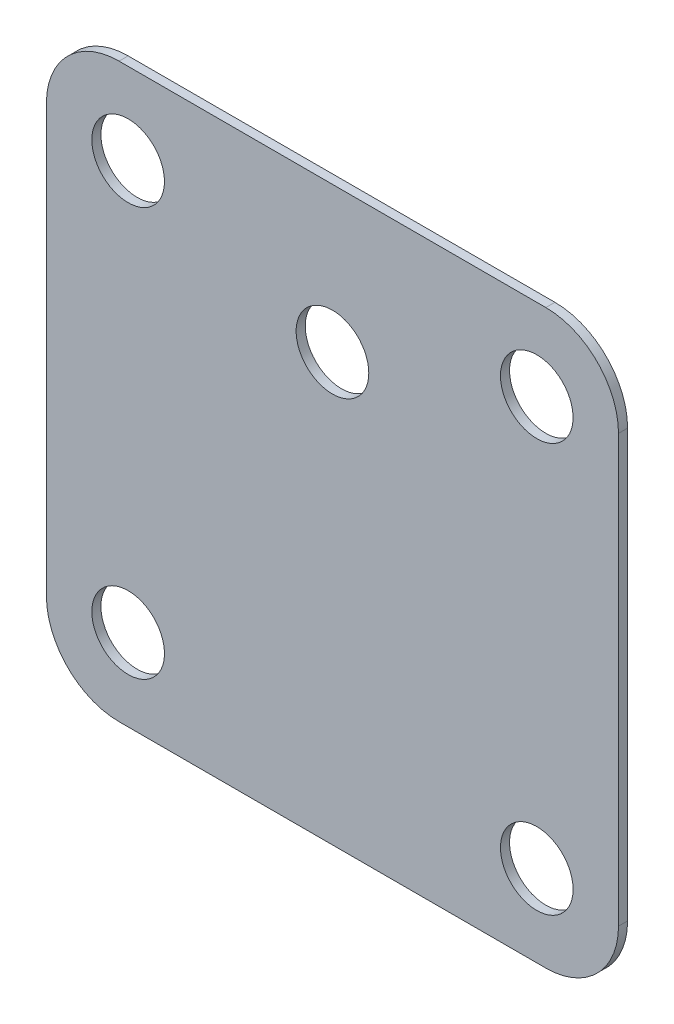
ISO-10303-21;
HEADER;
FILE_DESCRIPTION(('STEP AP214'),'2;1');
FILE_NAME('part.step','',(''),(''),'','','');
FILE_SCHEMA(('AUTOMOTIVE_DESIGN { 1 0 10303 214 1 1 1 1 }'));
ENDSEC;
DATA;
#1=APPLICATION_CONTEXT('core data for automotive mechanical design processes');
#2=APPLICATION_PROTOCOL_DEFINITION('international standard','automotive_design',2000,#1);
#3=PRODUCT_CONTEXT('',#1,'mechanical');
#4=PRODUCT('Part','Part','',(#3));
#5=PRODUCT_RELATED_PRODUCT_CATEGORY('part','',(#4));
#6=PRODUCT_DEFINITION_FORMATION('','',#4);
#7=PRODUCT_DEFINITION_CONTEXT('part definition',#1,'design');
#8=PRODUCT_DEFINITION('design','',#6,#7);
#9=PRODUCT_DEFINITION_SHAPE('','',#8);
#10=(LENGTH_UNIT() NAMED_UNIT(*) SI_UNIT(.MILLI.,.METRE.));
#11=(NAMED_UNIT(*) PLANE_ANGLE_UNIT() SI_UNIT($,.RADIAN.));
#12=(NAMED_UNIT(*) SI_UNIT($,.STERADIAN.) SOLID_ANGLE_UNIT());
#13=UNCERTAINTY_MEASURE_WITH_UNIT(LENGTH_MEASURE(1.E-05),#10,'distance_accuracy_value','');
#14=(GEOMETRIC_REPRESENTATION_CONTEXT(3) GLOBAL_UNCERTAINTY_ASSIGNED_CONTEXT((#13)) GLOBAL_UNIT_ASSIGNED_CONTEXT((#10,
#11,#12)) REPRESENTATION_CONTEXT('',''));
#15=CARTESIAN_POINT('',(0.,0.,0.));
#16=DIRECTION('',(0.,0.,1.));
#17=DIRECTION('',(1.,0.,0.));
#18=AXIS2_PLACEMENT_3D('',#15,#16,#17);
#19=CARTESIAN_POINT('',(-23.5,23.5,1.));
#20=DIRECTION('',(0.,0.,1.));
#21=DIRECTION('',(1.,0.,0.));
#22=AXIS2_PLACEMENT_3D('',#19,#20,#21);
#23=PLANE('',#22);
#24=CARTESIAN_POINT('',(-22.5,-22.5,1.));
#25=DIRECTION('',(0.,0.,1.));
#26=DIRECTION('',(-1.,0.,0.));
#27=AXIS2_PLACEMENT_3D('',#24,#25,#26);
#28=CIRCLE('',#27,4.);
#29=CARTESIAN_POINT('',(-26.5,-22.5,1.));
#30=VERTEX_POINT('',#29);
#31=EDGE_CURVE('E229',#30,#30,#28,.T.);
#32=ORIENTED_EDGE('',*,*,#31,.F.);
#33=EDGE_LOOP('',(#32));
#34=FACE_BOUND('',#33,.T.);
#35=CARTESIAN_POINT('',(22.5,22.4999999999999,1.));
#36=DIRECTION('',(0.,0.,1.));
#37=DIRECTION('',(-1.,0.,0.));
#38=AXIS2_PLACEMENT_3D('',#35,#36,#37);
#39=CIRCLE('',#38,4.);
#40=CARTESIAN_POINT('',(18.5,22.4999999999999,1.));
#41=VERTEX_POINT('',#40);
#42=EDGE_CURVE('E213',#41,#41,#39,.T.);
#43=ORIENTED_EDGE('',*,*,#42,.F.);
#44=EDGE_LOOP('',(#43));
#45=FACE_BOUND('',#44,.T.);
#46=CARTESIAN_POINT('',(-23.5,23.5,1.));
#47=DIRECTION('',(0.,0.,1.));
#48=DIRECTION('',(1.,0.,0.));
#49=AXIS2_PLACEMENT_3D('',#46,#47,#48);
#50=CIRCLE('',#49,8.);
#51=CARTESIAN_POINT('',(-23.5,31.5,1.));
#52=VERTEX_POINT('',#51);
#53=CARTESIAN_POINT('',(-31.5,23.4999999999999,1.));
#54=VERTEX_POINT('',#53);
#55=EDGE_CURVE('E164',#52,#54,#50,.T.);
#56=ORIENTED_EDGE('',*,*,#55,.T.);
#57=DIRECTION('',(0.,-1.,0.));
#58=VECTOR('',#57,1.);
#59=CARTESIAN_POINT('',(-31.5,23.4999999999999,1.));
#60=LINE('',#59,#58);
#61=CARTESIAN_POINT('',(-31.5,-23.5,1.));
#62=VERTEX_POINT('',#61);
#63=EDGE_CURVE('E100',#54,#62,#60,.T.);
#64=ORIENTED_EDGE('',*,*,#63,.T.);
#65=CARTESIAN_POINT('',(-23.5,-23.5,1.));
#66=DIRECTION('',(0.,0.,1.));
#67=DIRECTION('',(-1.,0.,0.));
#68=AXIS2_PLACEMENT_3D('',#65,#66,#67);
#69=CIRCLE('',#68,8.);
#70=CARTESIAN_POINT('',(-23.5,-31.5,1.));
#71=VERTEX_POINT('',#70);
#72=EDGE_CURVE('E185',#62,#71,#69,.T.);
#73=ORIENTED_EDGE('',*,*,#72,.T.);
#74=DIRECTION('',(1.,0.,0.));
#75=VECTOR('',#74,1.);
#76=CARTESIAN_POINT('',(-23.5,-31.5,1.));
#77=LINE('',#76,#75);
#78=CARTESIAN_POINT('',(23.4999999999999,-31.5,1.));
#79=VERTEX_POINT('',#78);
#80=EDGE_CURVE('E199',#71,#79,#77,.T.);
#81=ORIENTED_EDGE('',*,*,#80,.T.);
#82=CARTESIAN_POINT('',(23.5,-23.5,1.));
#83=DIRECTION('',(0.,0.,1.));
#84=DIRECTION('',(1.,0.,0.));
#85=AXIS2_PLACEMENT_3D('',#82,#83,#84);
#86=CIRCLE('',#85,8.);
#87=CARTESIAN_POINT('',(31.5,-23.4999999999999,1.));
#88=VERTEX_POINT('',#87);
#89=EDGE_CURVE('E119',#79,#88,#86,.T.);
#90=ORIENTED_EDGE('',*,*,#89,.T.);
#91=DIRECTION('',(0.,1.,0.));
#92=VECTOR('',#91,1.);
#93=CARTESIAN_POINT('',(31.5,23.4999999999999,1.));
#94=LINE('',#93,#92);
#95=CARTESIAN_POINT('',(31.5,23.4999999999999,1.));
#96=VERTEX_POINT('',#95);
#97=EDGE_CURVE('E113',#88,#96,#94,.T.);
#98=ORIENTED_EDGE('',*,*,#97,.T.);
#99=CARTESIAN_POINT('',(23.5,23.5,1.));
#100=DIRECTION('',(0.,0.,1.));
#101=DIRECTION('',(1.,0.,0.));
#102=AXIS2_PLACEMENT_3D('',#99,#100,#101);
#103=CIRCLE('',#102,8.);
#104=CARTESIAN_POINT('',(23.4999999999999,31.5,1.));
#105=VERTEX_POINT('',#104);
#106=EDGE_CURVE('E117',#96,#105,#103,.T.);
#107=ORIENTED_EDGE('',*,*,#106,.T.);
#108=DIRECTION('',(-1.,0.,0.));
#109=VECTOR('',#108,1.);
#110=CARTESIAN_POINT('',(-23.5,31.5,1.));
#111=LINE('',#110,#109);
#112=EDGE_CURVE('E57',#105,#52,#111,.T.);
#113=ORIENTED_EDGE('',*,*,#112,.T.);
#114=EDGE_LOOP('',(#56,#64,#73,#81,#90,#98,#107,#113));
#115=FACE_BOUND('',#114,.T.);
#116=CARTESIAN_POINT('',(-22.5,22.5,1.));
#117=DIRECTION('',(0.,0.,1.));
#118=DIRECTION('',(1.,0.,0.));
#119=AXIS2_PLACEMENT_3D('',#116,#117,#118);
#120=CIRCLE('',#119,4.);
#121=CARTESIAN_POINT('',(-18.5,22.5,1.));
#122=VERTEX_POINT('',#121);
#123=EDGE_CURVE('E146',#122,#122,#120,.T.);
#124=ORIENTED_EDGE('',*,*,#123,.F.);
#125=EDGE_LOOP('',(#124));
#126=FACE_BOUND('',#125,.T.);
#127=CARTESIAN_POINT('',(22.5,-22.4999999999999,1.));
#128=DIRECTION('',(0.,0.,1.));
#129=DIRECTION('',(1.,0.,0.));
#130=AXIS2_PLACEMENT_3D('',#127,#128,#129);
#131=CIRCLE('',#130,4.);
#132=CARTESIAN_POINT('',(26.5,-22.4999999999999,1.));
#133=VERTEX_POINT('',#132);
#134=EDGE_CURVE('E221',#133,#133,#131,.T.);
#135=ORIENTED_EDGE('',*,*,#134,.F.);
#136=EDGE_LOOP('',(#135));
#137=FACE_BOUND('',#136,.T.);
#138=CARTESIAN_POINT('',(0.,15.5,1.));
#139=DIRECTION('',(0.,0.,1.));
#140=DIRECTION('',(1.,0.,0.));
#141=AXIS2_PLACEMENT_3D('',#138,#139,#140);
#142=CIRCLE('',#141,4.);
#143=CARTESIAN_POINT('',(4.,15.5,1.));
#144=VERTEX_POINT('',#143);
#145=EDGE_CURVE('E237',#144,#144,#142,.T.);
#146=ORIENTED_EDGE('',*,*,#145,.F.);
#147=EDGE_LOOP('',(#146));
#148=FACE_BOUND('',#147,.T.);
#149=ADVANCED_FACE('F39',(#34,#45,#115,#126,#137,#148),#23,.T.);
#150=CARTESIAN_POINT('',(-23.5,23.5,0.));
#151=DIRECTION('',(0.,0.,1.));
#152=DIRECTION('',(1.,0.,0.));
#153=AXIS2_PLACEMENT_3D('',#150,#151,#152);
#154=PLANE('',#153);
#155=CARTESIAN_POINT('',(-23.5,23.5,0.));
#156=DIRECTION('',(0.,0.,1.));
#157=DIRECTION('',(1.,0.,0.));
#158=AXIS2_PLACEMENT_3D('',#155,#156,#157);
#159=CIRCLE('',#158,8.);
#160=CARTESIAN_POINT('',(-23.5,31.5,0.));
#161=VERTEX_POINT('',#160);
#162=CARTESIAN_POINT('',(-31.5,23.4999999999999,0.));
#163=VERTEX_POINT('',#162);
#164=EDGE_CURVE('E141',#161,#163,#159,.T.);
#165=ORIENTED_EDGE('',*,*,#164,.F.);
#166=DIRECTION('',(-1.,0.,0.));
#167=VECTOR('',#166,1.);
#168=CARTESIAN_POINT('',(-23.5,31.5,0.));
#169=LINE('',#168,#167);
#170=CARTESIAN_POINT('',(23.4999999999999,31.5,0.));
#171=VERTEX_POINT('',#170);
#172=EDGE_CURVE('E92',#171,#161,#169,.T.);
#173=ORIENTED_EDGE('',*,*,#172,.F.);
#174=CARTESIAN_POINT('',(23.5,23.5,0.));
#175=DIRECTION('',(0.,0.,1.));
#176=DIRECTION('',(1.,0.,0.));
#177=AXIS2_PLACEMENT_3D('',#174,#175,#176);
#178=CIRCLE('',#177,8.);
#179=CARTESIAN_POINT('',(31.5,23.4999999999999,0.));
#180=VERTEX_POINT('',#179);
#181=EDGE_CURVE('E86',#180,#171,#178,.T.);
#182=ORIENTED_EDGE('',*,*,#181,.F.);
#183=DIRECTION('',(0.,1.,0.));
#184=VECTOR('',#183,1.);
#185=CARTESIAN_POINT('',(31.5,23.4999999999999,0.));
#186=LINE('',#185,#184);
#187=CARTESIAN_POINT('',(31.5,-23.4999999999999,0.));
#188=VERTEX_POINT('',#187);
#189=EDGE_CURVE('E128',#188,#180,#186,.T.);
#190=ORIENTED_EDGE('',*,*,#189,.F.);
#191=CARTESIAN_POINT('',(23.5,-23.5,0.));
#192=DIRECTION('',(0.,0.,1.));
#193=DIRECTION('',(1.,0.,0.));
#194=AXIS2_PLACEMENT_3D('',#191,#192,#193);
#195=CIRCLE('',#194,8.);
#196=CARTESIAN_POINT('',(23.4999999999999,-31.5,0.));
#197=VERTEX_POINT('',#196);
#198=EDGE_CURVE('E155',#197,#188,#195,.T.);
#199=ORIENTED_EDGE('',*,*,#198,.F.);
#200=DIRECTION('',(1.,0.,0.));
#201=VECTOR('',#200,1.);
#202=CARTESIAN_POINT('',(-23.5,-31.5,0.));
#203=LINE('',#202,#201);
#204=CARTESIAN_POINT('',(-23.5,-31.5,0.));
#205=VERTEX_POINT('',#204);
#206=EDGE_CURVE('E152',#205,#197,#203,.T.);
#207=ORIENTED_EDGE('',*,*,#206,.F.);
#208=CARTESIAN_POINT('',(-23.5,-23.5,0.));
#209=DIRECTION('',(0.,0.,1.));
#210=DIRECTION('',(-1.,0.,0.));
#211=AXIS2_PLACEMENT_3D('',#208,#209,#210);
#212=CIRCLE('',#211,8.);
#213=CARTESIAN_POINT('',(-31.5,-23.5,0.));
#214=VERTEX_POINT('',#213);
#215=EDGE_CURVE('E149',#214,#205,#212,.T.);
#216=ORIENTED_EDGE('',*,*,#215,.F.);
#217=DIRECTION('',(0.,-1.,0.));
#218=VECTOR('',#217,1.);
#219=CARTESIAN_POINT('',(-31.5,23.4999999999999,0.));
#220=LINE('',#219,#218);
#221=EDGE_CURVE('E145',#163,#214,#220,.T.);
#222=ORIENTED_EDGE('',*,*,#221,.F.);
#223=EDGE_LOOP('',(#165,#173,#182,#190,#199,#207,#216,#222));
#224=FACE_BOUND('',#223,.T.);
#225=CARTESIAN_POINT('',(-22.5,22.5,0.));
#226=DIRECTION('',(0.,0.,1.));
#227=DIRECTION('',(1.,0.,0.));
#228=AXIS2_PLACEMENT_3D('',#225,#226,#227);
#229=CIRCLE('',#228,4.);
#230=CARTESIAN_POINT('',(-18.5,22.5,0.));
#231=VERTEX_POINT('',#230);
#232=EDGE_CURVE('E209',#231,#231,#229,.T.);
#233=ORIENTED_EDGE('',*,*,#232,.T.);
#234=EDGE_LOOP('',(#233));
#235=FACE_BOUND('',#234,.T.);
#236=CARTESIAN_POINT('',(22.5,22.4999999999999,0.));
#237=DIRECTION('',(0.,0.,1.));
#238=DIRECTION('',(-1.,0.,0.));
#239=AXIS2_PLACEMENT_3D('',#236,#237,#238);
#240=CIRCLE('',#239,4.);
#241=CARTESIAN_POINT('',(18.5,22.4999999999999,0.));
#242=VERTEX_POINT('',#241);
#243=EDGE_CURVE('E217',#242,#242,#240,.T.);
#244=ORIENTED_EDGE('',*,*,#243,.T.);
#245=EDGE_LOOP('',(#244));
#246=FACE_BOUND('',#245,.T.);
#247=CARTESIAN_POINT('',(22.5,-22.4999999999999,0.));
#248=DIRECTION('',(0.,0.,1.));
#249=DIRECTION('',(1.,0.,0.));
#250=AXIS2_PLACEMENT_3D('',#247,#248,#249);
#251=CIRCLE('',#250,4.);
#252=CARTESIAN_POINT('',(26.5,-22.4999999999999,0.));
#253=VERTEX_POINT('',#252);
#254=EDGE_CURVE('E225',#253,#253,#251,.T.);
#255=ORIENTED_EDGE('',*,*,#254,.T.);
#256=EDGE_LOOP('',(#255));
#257=FACE_BOUND('',#256,.T.);
#258=CARTESIAN_POINT('',(-22.5,-22.5,0.));
#259=DIRECTION('',(0.,0.,1.));
#260=DIRECTION('',(-1.,0.,0.));
#261=AXIS2_PLACEMENT_3D('',#258,#259,#260);
#262=CIRCLE('',#261,4.);
#263=CARTESIAN_POINT('',(-26.5,-22.5,0.));
#264=VERTEX_POINT('',#263);
#265=EDGE_CURVE('E233',#264,#264,#262,.T.);
#266=ORIENTED_EDGE('',*,*,#265,.T.);
#267=EDGE_LOOP('',(#266));
#268=FACE_BOUND('',#267,.T.);
#269=CARTESIAN_POINT('',(0.,15.5,0.));
#270=DIRECTION('',(0.,0.,1.));
#271=DIRECTION('',(1.,0.,0.));
#272=AXIS2_PLACEMENT_3D('',#269,#270,#271);
#273=CIRCLE('',#272,4.);
#274=CARTESIAN_POINT('',(4.,15.5,0.));
#275=VERTEX_POINT('',#274);
#276=EDGE_CURVE('E241',#275,#275,#273,.T.);
#277=ORIENTED_EDGE('',*,*,#276,.T.);
#278=EDGE_LOOP('',(#277));
#279=FACE_BOUND('',#278,.T.);
#280=ADVANCED_FACE('F189',(#224,#235,#246,#257,#268,#279),#154,.F.);
#281=CARTESIAN_POINT('',(-23.5,23.5,1.));
#282=DIRECTION('',(0.,0.,-1.));
#283=DIRECTION('',(-1.,0.,0.));
#284=AXIS2_PLACEMENT_3D('',#281,#282,#283);
#285=CYLINDRICAL_SURFACE('',#284,8.);
#286=ORIENTED_EDGE('',*,*,#164,.T.);
#287=DIRECTION('',(0.,0.,-1.));
#288=VECTOR('',#287,1.);
#289=CARTESIAN_POINT('',(-31.5,23.4999999999999,1.));
#290=LINE('',#289,#288);
#291=EDGE_CURVE('E11',#54,#163,#290,.T.);
#292=ORIENTED_EDGE('',*,*,#291,.F.);
#293=ORIENTED_EDGE('',*,*,#55,.F.);
#294=DIRECTION('',(0.,0.,-1.));
#295=VECTOR('',#294,1.);
#296=CARTESIAN_POINT('',(-23.5,31.5,1.));
#297=LINE('',#296,#295);
#298=EDGE_CURVE('E137',#52,#161,#297,.T.);
#299=ORIENTED_EDGE('',*,*,#298,.T.);
#300=EDGE_LOOP('',(#286,#292,#293,#299));
#301=FACE_BOUND('',#300,.T.);
#302=ADVANCED_FACE('F41',(#301),#285,.T.);
#303=CARTESIAN_POINT('',(-31.5,23.4999999999999,1.));
#304=DIRECTION('',(1.,0.,0.));
#305=DIRECTION('',(0.,0.,-1.));
#306=AXIS2_PLACEMENT_3D('',#303,#304,#305);
#307=PLANE('',#306);
#308=ORIENTED_EDGE('',*,*,#221,.T.);
#309=DIRECTION('',(0.,0.,-1.));
#310=VECTOR('',#309,1.);
#311=CARTESIAN_POINT('',(-31.5,-23.5,1.));
#312=LINE('',#311,#310);
#313=EDGE_CURVE('E49',#62,#214,#312,.T.);
#314=ORIENTED_EDGE('',*,*,#313,.F.);
#315=ORIENTED_EDGE('',*,*,#63,.F.);
#316=ORIENTED_EDGE('',*,*,#291,.T.);
#317=EDGE_LOOP('',(#308,#314,#315,#316));
#318=FACE_BOUND('',#317,.T.);
#319=ADVANCED_FACE('F277',(#318),#307,.F.);
#320=CARTESIAN_POINT('',(-23.5,-23.5,1.));
#321=DIRECTION('',(0.,0.,-1.));
#322=DIRECTION('',(-1.,0.,0.));
#323=AXIS2_PLACEMENT_3D('',#320,#321,#322);
#324=CYLINDRICAL_SURFACE('',#323,8.);
#325=ORIENTED_EDGE('',*,*,#215,.T.);
#326=DIRECTION('',(0.,0.,-1.));
#327=VECTOR('',#326,1.);
#328=CARTESIAN_POINT('',(-23.5,-31.5,1.));
#329=LINE('',#328,#327);
#330=EDGE_CURVE('E175',#71,#205,#329,.T.);
#331=ORIENTED_EDGE('',*,*,#330,.F.);
#332=ORIENTED_EDGE('',*,*,#72,.F.);
#333=ORIENTED_EDGE('',*,*,#313,.T.);
#334=EDGE_LOOP('',(#325,#331,#332,#333));
#335=FACE_BOUND('',#334,.T.);
#336=ADVANCED_FACE('F183',(#335),#324,.T.);
#337=CARTESIAN_POINT('',(-23.5,-31.5,1.));
#338=DIRECTION('',(0.,1.,0.));
#339=DIRECTION('',(0.,0.,1.));
#340=AXIS2_PLACEMENT_3D('',#337,#338,#339);
#341=PLANE('',#340);
#342=ORIENTED_EDGE('',*,*,#206,.T.);
#343=DIRECTION('',(0.,0.,-1.));
#344=VECTOR('',#343,1.);
#345=CARTESIAN_POINT('',(23.4999999999999,-31.5,1.));
#346=LINE('',#345,#344);
#347=EDGE_CURVE('E171',#79,#197,#346,.T.);
#348=ORIENTED_EDGE('',*,*,#347,.F.);
#349=ORIENTED_EDGE('',*,*,#80,.F.);
#350=ORIENTED_EDGE('',*,*,#330,.T.);
#351=EDGE_LOOP('',(#342,#348,#349,#350));
#352=FACE_BOUND('',#351,.T.);
#353=ADVANCED_FACE('F194',(#352),#341,.F.);
#354=CARTESIAN_POINT('',(23.5,-23.5,1.));
#355=DIRECTION('',(0.,0.,-1.));
#356=DIRECTION('',(-1.,0.,0.));
#357=AXIS2_PLACEMENT_3D('',#354,#355,#356);
#358=CYLINDRICAL_SURFACE('',#357,8.);
#359=ORIENTED_EDGE('',*,*,#198,.T.);
#360=DIRECTION('',(0.,0.,-1.));
#361=VECTOR('',#360,1.);
#362=CARTESIAN_POINT('',(31.5,-23.4999999999999,1.));
#363=LINE('',#362,#361);
#364=EDGE_CURVE('E130',#88,#188,#363,.T.);
#365=ORIENTED_EDGE('',*,*,#364,.F.);
#366=ORIENTED_EDGE('',*,*,#89,.F.);
#367=ORIENTED_EDGE('',*,*,#347,.T.);
#368=EDGE_LOOP('',(#359,#365,#366,#367));
#369=FACE_BOUND('',#368,.T.);
#370=ADVANCED_FACE('F197',(#369),#358,.T.);
#371=CARTESIAN_POINT('',(31.5,23.4999999999999,1.));
#372=DIRECTION('',(-1.,0.,0.));
#373=DIRECTION('',(0.,-1.,0.));
#374=AXIS2_PLACEMENT_3D('',#371,#372,#373);
#375=PLANE('',#374);
#376=ORIENTED_EDGE('',*,*,#189,.T.);
#377=DIRECTION('',(0.,0.,-1.));
#378=VECTOR('',#377,1.);
#379=CARTESIAN_POINT('',(31.5,23.4999999999999,1.));
#380=LINE('',#379,#378);
#381=EDGE_CURVE('E125',#96,#180,#380,.T.);
#382=ORIENTED_EDGE('',*,*,#381,.F.);
#383=ORIENTED_EDGE('',*,*,#97,.F.);
#384=ORIENTED_EDGE('',*,*,#364,.T.);
#385=EDGE_LOOP('',(#376,#382,#383,#384));
#386=FACE_BOUND('',#385,.T.);
#387=ADVANCED_FACE('F126',(#386),#375,.F.);
#388=CARTESIAN_POINT('',(23.5,23.5,1.));
#389=DIRECTION('',(0.,0.,-1.));
#390=DIRECTION('',(-1.,0.,0.));
#391=AXIS2_PLACEMENT_3D('',#388,#389,#390);
#392=CYLINDRICAL_SURFACE('',#391,8.);
#393=ORIENTED_EDGE('',*,*,#181,.T.);
#394=DIRECTION('',(0.,0.,-1.));
#395=VECTOR('',#394,1.);
#396=CARTESIAN_POINT('',(23.4999999999999,31.5,1.));
#397=LINE('',#396,#395);
#398=EDGE_CURVE('E131',#105,#171,#397,.T.);
#399=ORIENTED_EDGE('',*,*,#398,.F.);
#400=ORIENTED_EDGE('',*,*,#106,.F.);
#401=ORIENTED_EDGE('',*,*,#381,.T.);
#402=EDGE_LOOP('',(#393,#399,#400,#401));
#403=FACE_BOUND('',#402,.T.);
#404=ADVANCED_FACE('F133',(#403),#392,.T.);
#405=CARTESIAN_POINT('',(-23.5,31.5,1.));
#406=DIRECTION('',(0.,-1.,0.));
#407=DIRECTION('',(0.,0.,-1.));
#408=AXIS2_PLACEMENT_3D('',#405,#406,#407);
#409=PLANE('',#408);
#410=ORIENTED_EDGE('',*,*,#172,.T.);
#411=ORIENTED_EDGE('',*,*,#298,.F.);
#412=ORIENTED_EDGE('',*,*,#112,.F.);
#413=ORIENTED_EDGE('',*,*,#398,.T.);
#414=EDGE_LOOP('',(#410,#411,#412,#413));
#415=FACE_BOUND('',#414,.T.);
#416=ADVANCED_FACE('F265',(#415),#409,.F.);
#417=CARTESIAN_POINT('',(-22.5,22.5,1.));
#418=DIRECTION('',(0.,0.,-1.));
#419=DIRECTION('',(-1.,0.,0.));
#420=AXIS2_PLACEMENT_3D('',#417,#418,#419);
#421=CYLINDRICAL_SURFACE('',#420,4.);
#422=ORIENTED_EDGE('',*,*,#123,.T.);
#423=EDGE_LOOP('',(#422));
#424=FACE_BOUND('',#423,.T.);
#425=ORIENTED_EDGE('',*,*,#232,.F.);
#426=EDGE_LOOP('',(#425));
#427=FACE_BOUND('',#426,.T.);
#428=ADVANCED_FACE('F262',(#424,#427),#421,.F.);
#429=CARTESIAN_POINT('',(22.5,22.4999999999999,1.));
#430=DIRECTION('',(0.,0.,-1.));
#431=DIRECTION('',(-1.,0.,0.));
#432=AXIS2_PLACEMENT_3D('',#429,#430,#431);
#433=CYLINDRICAL_SURFACE('',#432,4.);
#434=ORIENTED_EDGE('',*,*,#42,.T.);
#435=EDGE_LOOP('',(#434));
#436=FACE_BOUND('',#435,.T.);
#437=ORIENTED_EDGE('',*,*,#243,.F.);
#438=EDGE_LOOP('',(#437));
#439=FACE_BOUND('',#438,.T.);
#440=ADVANCED_FACE('F341',(#436,#439),#433,.F.);
#441=CARTESIAN_POINT('',(22.5,-22.4999999999999,1.));
#442=DIRECTION('',(0.,0.,-1.));
#443=DIRECTION('',(-1.,0.,0.));
#444=AXIS2_PLACEMENT_3D('',#441,#442,#443);
#445=CYLINDRICAL_SURFACE('',#444,4.);
#446=ORIENTED_EDGE('',*,*,#134,.T.);
#447=EDGE_LOOP('',(#446));
#448=FACE_BOUND('',#447,.T.);
#449=ORIENTED_EDGE('',*,*,#254,.F.);
#450=EDGE_LOOP('',(#449));
#451=FACE_BOUND('',#450,.T.);
#452=ADVANCED_FACE('F349',(#448,#451),#445,.F.);
#453=CARTESIAN_POINT('',(-22.5,-22.5,1.));
#454=DIRECTION('',(0.,0.,-1.));
#455=DIRECTION('',(-1.,0.,0.));
#456=AXIS2_PLACEMENT_3D('',#453,#454,#455);
#457=CYLINDRICAL_SURFACE('',#456,4.);
#458=ORIENTED_EDGE('',*,*,#31,.T.);
#459=EDGE_LOOP('',(#458));
#460=FACE_BOUND('',#459,.T.);
#461=ORIENTED_EDGE('',*,*,#265,.F.);
#462=EDGE_LOOP('',(#461));
#463=FACE_BOUND('',#462,.T.);
#464=ADVANCED_FACE('F357',(#460,#463),#457,.F.);
#465=CARTESIAN_POINT('',(0.,15.5,1.));
#466=DIRECTION('',(0.,0.,-1.));
#467=DIRECTION('',(-1.,0.,0.));
#468=AXIS2_PLACEMENT_3D('',#465,#466,#467);
#469=CYLINDRICAL_SURFACE('',#468,4.);
#470=ORIENTED_EDGE('',*,*,#145,.T.);
#471=EDGE_LOOP('',(#470));
#472=FACE_BOUND('',#471,.T.);
#473=ORIENTED_EDGE('',*,*,#276,.F.);
#474=EDGE_LOOP('',(#473));
#475=FACE_BOUND('',#474,.T.);
#476=ADVANCED_FACE('F249',(#472,#475),#469,.F.);
#477=CLOSED_SHELL('',(#149,#280,#302,#319,#336,#353,#370,#387,#404,#416,#428,#440,#452,#464,#476));
#478=MANIFOLD_SOLID_BREP('B2',#477);
#479=ADVANCED_BREP_SHAPE_REPRESENTATION('',(#18,#478),#14);
#480=SHAPE_DEFINITION_REPRESENTATION(#9,#479);
ENDSEC;
END-ISO-10303-21;
